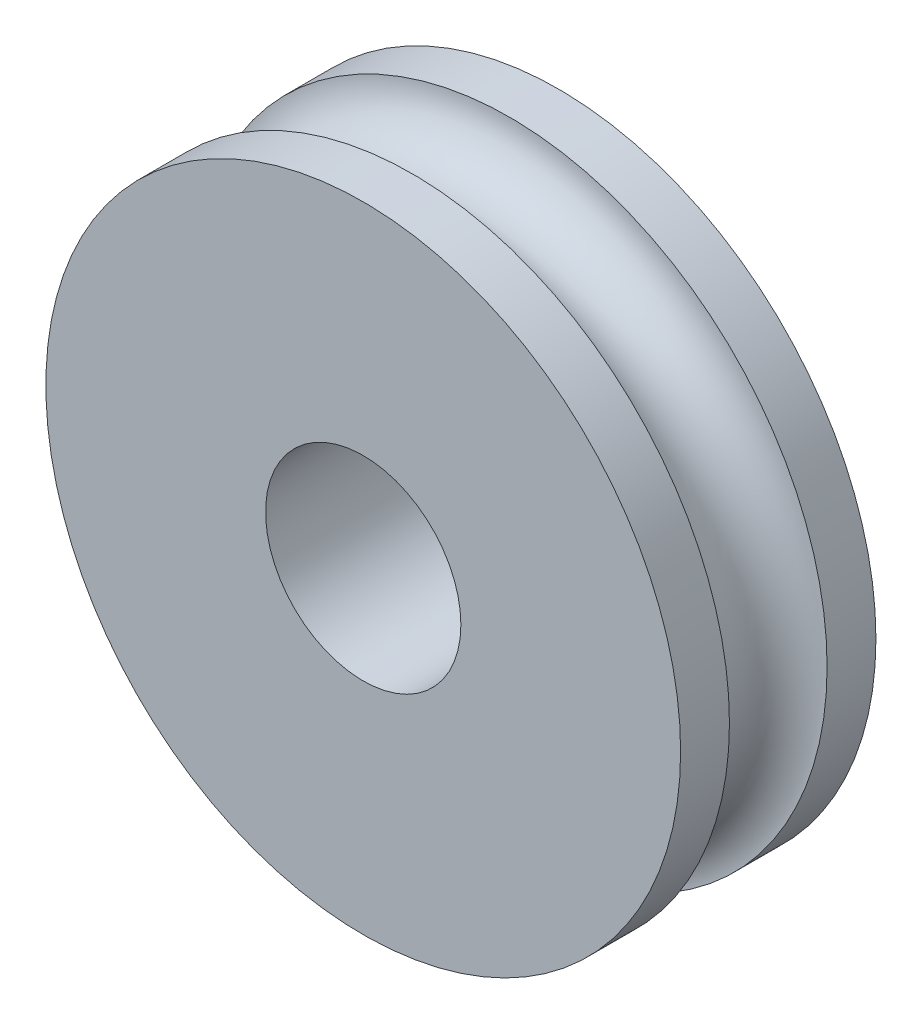
ISO-10303-21;
HEADER;
FILE_DESCRIPTION(('STEP AP214'),'2;1');
FILE_NAME('part.step','',(''),(''),'','','');
FILE_SCHEMA(('AUTOMOTIVE_DESIGN { 1 0 10303 214 1 1 1 1 }'));
ENDSEC;
DATA;
#1=APPLICATION_CONTEXT('core data for automotive mechanical design processes');
#2=APPLICATION_PROTOCOL_DEFINITION('international standard','automotive_design',2000,#1);
#3=PRODUCT_CONTEXT('',#1,'mechanical');
#4=PRODUCT('Part','Part','',(#3));
#5=PRODUCT_RELATED_PRODUCT_CATEGORY('part','',(#4));
#6=PRODUCT_DEFINITION_FORMATION('','',#4);
#7=PRODUCT_DEFINITION_CONTEXT('part definition',#1,'design');
#8=PRODUCT_DEFINITION('design','',#6,#7);
#9=PRODUCT_DEFINITION_SHAPE('','',#8);
#10=(LENGTH_UNIT() NAMED_UNIT(*) SI_UNIT(.MILLI.,.METRE.));
#11=(NAMED_UNIT(*) PLANE_ANGLE_UNIT() SI_UNIT($,.RADIAN.));
#12=(NAMED_UNIT(*) SI_UNIT($,.STERADIAN.) SOLID_ANGLE_UNIT());
#13=UNCERTAINTY_MEASURE_WITH_UNIT(LENGTH_MEASURE(1.E-05),#10,'distance_accuracy_value','');
#14=(GEOMETRIC_REPRESENTATION_CONTEXT(3) GLOBAL_UNCERTAINTY_ASSIGNED_CONTEXT((#13)) GLOBAL_UNIT_ASSIGNED_CONTEXT((#10,
#11,#12)) REPRESENTATION_CONTEXT('',''));
#15=CARTESIAN_POINT('',(0.,0.,0.));
#16=DIRECTION('',(0.,0.,1.));
#17=DIRECTION('',(1.,0.,0.));
#18=AXIS2_PLACEMENT_3D('',#15,#16,#17);
#19=CARTESIAN_POINT('',(0.,0.,-2.));
#20=DIRECTION('',(0.,0.,1.));
#21=DIRECTION('',(1.,0.,0.));
#22=AXIS2_PLACEMENT_3D('',#19,#20,#21);
#23=CYLINDRICAL_SURFACE('',#22,6.5);
#24=CARTESIAN_POINT('',(0.,0.,1.));
#25=DIRECTION('',(0.,0.,-1.));
#26=DIRECTION('',(-1.,0.,0.));
#27=AXIS2_PLACEMENT_3D('',#24,#25,#26);
#28=CIRCLE('',#27,6.5);
#29=CARTESIAN_POINT('',(6.5,0.,1.));
#30=VERTEX_POINT('',#29);
#31=EDGE_CURVE('E12',#30,#30,#28,.T.);
#32=ORIENTED_EDGE('',*,*,#31,.F.);
#33=EDGE_LOOP('',(#32));
#34=FACE_BOUND('',#33,.T.);
#35=CARTESIAN_POINT('',(0.,0.,2.));
#36=DIRECTION('',(0.,0.,1.));
#37=DIRECTION('',(1.,0.,0.));
#38=AXIS2_PLACEMENT_3D('',#35,#36,#37);
#39=CIRCLE('',#38,6.5);
#40=CARTESIAN_POINT('',(6.5,0.,2.));
#41=VERTEX_POINT('',#40);
#42=EDGE_CURVE('E76',#41,#41,#39,.T.);
#43=ORIENTED_EDGE('',*,*,#42,.F.);
#44=EDGE_LOOP('',(#43));
#45=FACE_BOUND('',#44,.T.);
#46=ADVANCED_FACE('F56',(#34,#45),#23,.T.);
#47=CARTESIAN_POINT('',(0.,0.,2.));
#48=DIRECTION('',(0.,0.,1.));
#49=DIRECTION('',(1.,0.,0.));
#50=AXIS2_PLACEMENT_3D('',#47,#48,#49);
#51=PLANE('',#50);
#52=CARTESIAN_POINT('',(0.,0.,2.));
#53=DIRECTION('',(0.,0.,1.));
#54=DIRECTION('',(1.,0.,0.));
#55=AXIS2_PLACEMENT_3D('',#52,#53,#54);
#56=CIRCLE('',#55,2.);
#57=CARTESIAN_POINT('',(2.,0.,2.));
#58=VERTEX_POINT('',#57);
#59=EDGE_CURVE('E85',#58,#58,#56,.T.);
#60=ORIENTED_EDGE('',*,*,#59,.F.);
#61=EDGE_LOOP('',(#60));
#62=FACE_BOUND('',#61,.T.);
#63=ORIENTED_EDGE('',*,*,#42,.T.);
#64=EDGE_LOOP('',(#63));
#65=FACE_BOUND('',#64,.T.);
#66=ADVANCED_FACE('F106',(#62,#65),#51,.T.);
#67=CARTESIAN_POINT('',(0.,0.,0.));
#68=DIRECTION('',(0.,0.,1.));
#69=DIRECTION('',(1.,0.,0.));
#70=AXIS2_PLACEMENT_3D('',#67,#68,#69);
#71=TOROIDAL_SURFACE('',#70,6.5,1.);
#72=ORIENTED_EDGE('',*,*,#31,.T.);
#73=CARTESIAN_POINT('',(6.5,0.,0.));
#74=DIRECTION('',(0.,1.,0.));
#75=DIRECTION('',(-1.,0.,0.));
#76=AXIS2_PLACEMENT_3D('',#73,#74,#75);
#77=CIRCLE('',#76,1.);
#78=CARTESIAN_POINT('',(6.5,0.,-1.));
#79=VERTEX_POINT('',#78);
#80=EDGE_CURVE('E71',#79,#30,#77,.T.);
#81=ORIENTED_EDGE('',*,*,#80,.F.);
#82=CARTESIAN_POINT('',(0.,0.,-1.));
#83=DIRECTION('',(0.,0.,1.));
#84=DIRECTION('',(1.,0.,0.));
#85=AXIS2_PLACEMENT_3D('',#82,#83,#84);
#86=CIRCLE('',#85,6.5);
#87=EDGE_CURVE('E65',#79,#79,#86,.T.);
#88=ORIENTED_EDGE('',*,*,#87,.T.);
#89=ORIENTED_EDGE('',*,*,#80,.T.);
#90=EDGE_LOOP('',(#72,#81,#88,#89));
#91=FACE_BOUND('',#90,.T.);
#92=ADVANCED_FACE('F72',(#91),#71,.F.);
#93=CARTESIAN_POINT('',(0.,0.,-2.));
#94=DIRECTION('',(0.,0.,1.));
#95=DIRECTION('',(1.,0.,0.));
#96=AXIS2_PLACEMENT_3D('',#93,#94,#95);
#97=PLANE('',#96);
#98=CARTESIAN_POINT('',(0.,0.,-2.));
#99=DIRECTION('',(0.,0.,1.));
#100=DIRECTION('',(1.,0.,0.));
#101=AXIS2_PLACEMENT_3D('',#98,#99,#100);
#102=CIRCLE('',#101,2.);
#103=CARTESIAN_POINT('',(2.,0.,-2.));
#104=VERTEX_POINT('',#103);
#105=EDGE_CURVE('E77',#104,#104,#102,.T.);
#106=ORIENTED_EDGE('',*,*,#105,.T.);
#107=EDGE_LOOP('',(#106));
#108=FACE_BOUND('',#107,.T.);
#109=CARTESIAN_POINT('',(0.,0.,-2.));
#110=DIRECTION('',(0.,0.,1.));
#111=DIRECTION('',(1.,0.,0.));
#112=AXIS2_PLACEMENT_3D('',#109,#110,#111);
#113=CIRCLE('',#112,6.5);
#114=CARTESIAN_POINT('',(6.5,0.,-2.));
#115=VERTEX_POINT('',#114);
#116=EDGE_CURVE('E82',#115,#115,#113,.T.);
#117=ORIENTED_EDGE('',*,*,#116,.F.);
#118=EDGE_LOOP('',(#117));
#119=FACE_BOUND('',#118,.T.);
#120=ADVANCED_FACE('F95',(#108,#119),#97,.F.);
#121=ORIENTED_EDGE('',*,*,#87,.F.);
#122=EDGE_LOOP('',(#121));
#123=FACE_BOUND('',#122,.T.);
#124=ORIENTED_EDGE('',*,*,#116,.T.);
#125=EDGE_LOOP('',(#124));
#126=FACE_BOUND('',#125,.T.);
#127=ADVANCED_FACE('F58',(#123,#126),#23,.T.);
#128=CARTESIAN_POINT('',(0.,0.,-2.));
#129=DIRECTION('',(0.,0.,1.));
#130=DIRECTION('',(1.,0.,0.));
#131=AXIS2_PLACEMENT_3D('',#128,#129,#130);
#132=CYLINDRICAL_SURFACE('',#131,2.);
#133=ORIENTED_EDGE('',*,*,#105,.F.);
#134=EDGE_LOOP('',(#133));
#135=FACE_BOUND('',#134,.T.);
#136=ORIENTED_EDGE('',*,*,#59,.T.);
#137=EDGE_LOOP('',(#136));
#138=FACE_BOUND('',#137,.T.);
#139=ADVANCED_FACE('F103',(#135,#138),#132,.F.);
#140=CLOSED_SHELL('',(#46,#66,#92,#120,#127,#139));
#141=MANIFOLD_SOLID_BREP('B2',#140);
#142=ADVANCED_BREP_SHAPE_REPRESENTATION('',(#18,#141),#14);
#143=SHAPE_DEFINITION_REPRESENTATION(#9,#142);
ENDSEC;
END-ISO-10303-21;
